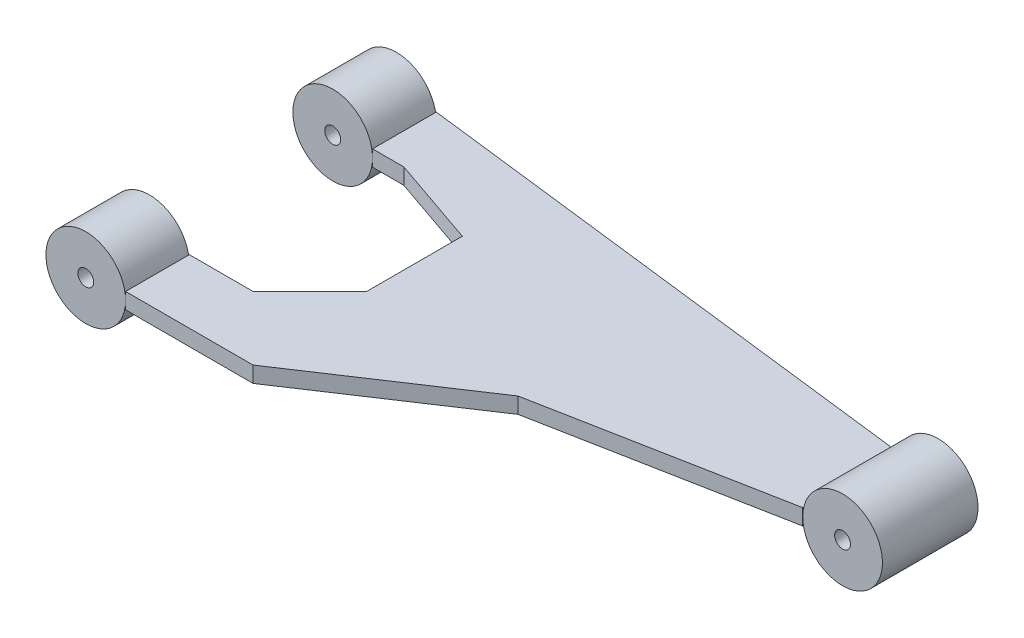
ISO-10303-21;
HEADER;
FILE_DESCRIPTION(('STEP AP214'),'2;1');
FILE_NAME('part.step','',(''),(''),'','','');
FILE_SCHEMA(('AUTOMOTIVE_DESIGN { 1 0 10303 214 1 1 1 1 }'));
ENDSEC;
DATA;
#1=APPLICATION_CONTEXT('core data for automotive mechanical design processes');
#2=APPLICATION_PROTOCOL_DEFINITION('international standard','automotive_design',2000,#1);
#3=PRODUCT_CONTEXT('',#1,'mechanical');
#4=PRODUCT('Part','Part','',(#3));
#5=PRODUCT_RELATED_PRODUCT_CATEGORY('part','',(#4));
#6=PRODUCT_DEFINITION_FORMATION('','',#4);
#7=PRODUCT_DEFINITION_CONTEXT('part definition',#1,'design');
#8=PRODUCT_DEFINITION('design','',#6,#7);
#9=PRODUCT_DEFINITION_SHAPE('','',#8);
#10=(LENGTH_UNIT() NAMED_UNIT(*) SI_UNIT(.MILLI.,.METRE.));
#11=(NAMED_UNIT(*) PLANE_ANGLE_UNIT() SI_UNIT($,.RADIAN.));
#12=(NAMED_UNIT(*) SI_UNIT($,.STERADIAN.) SOLID_ANGLE_UNIT());
#13=UNCERTAINTY_MEASURE_WITH_UNIT(LENGTH_MEASURE(1.E-05),#10,'distance_accuracy_value','');
#14=(GEOMETRIC_REPRESENTATION_CONTEXT(3) GLOBAL_UNCERTAINTY_ASSIGNED_CONTEXT((#13)) GLOBAL_UNIT_ASSIGNED_CONTEXT((#10,
#11,#12)) REPRESENTATION_CONTEXT('',''));
#15=CARTESIAN_POINT('',(0.,0.,0.));
#16=DIRECTION('',(0.,0.,1.));
#17=DIRECTION('',(1.,0.,0.));
#18=AXIS2_PLACEMENT_3D('',#15,#16,#17);
#19=CARTESIAN_POINT('',(0.,0.,123.825));
#20=DIRECTION('',(0.,0.,-1.));
#21=DIRECTION('',(-1.,0.,0.));
#22=AXIS2_PLACEMENT_3D('',#19,#20,#21);
#23=CYLINDRICAL_SURFACE('',#22,3.175);
#24=CARTESIAN_POINT('',(0.,0.,98.425));
#25=DIRECTION('',(0.,0.,1.));
#26=DIRECTION('',(1.,0.,0.));
#27=AXIS2_PLACEMENT_3D('',#24,#25,#26);
#28=CIRCLE('',#27,3.175);
#29=CARTESIAN_POINT('',(3.175,0.,98.425));
#30=VERTEX_POINT('',#29);
#31=EDGE_CURVE('E11',#30,#30,#28,.T.);
#32=ORIENTED_EDGE('',*,*,#31,.F.);
#33=EDGE_LOOP('',(#32));
#34=FACE_BOUND('',#33,.T.);
#35=CARTESIAN_POINT('',(0.,0.,123.825));
#36=DIRECTION('',(0.,0.,1.));
#37=DIRECTION('',(1.,0.,0.));
#38=AXIS2_PLACEMENT_3D('',#35,#36,#37);
#39=CIRCLE('',#38,3.175);
#40=CARTESIAN_POINT('',(3.175,0.,123.825));
#41=VERTEX_POINT('',#40);
#42=EDGE_CURVE('E56',#41,#41,#39,.T.);
#43=ORIENTED_EDGE('',*,*,#42,.T.);
#44=EDGE_LOOP('',(#43));
#45=FACE_BOUND('',#44,.T.);
#46=ADVANCED_FACE('F42',(#34,#45),#23,.F.);
#47=CARTESIAN_POINT('',(0.,0.,123.825));
#48=DIRECTION('',(0.,0.,1.));
#49=DIRECTION('',(1.,0.,0.));
#50=AXIS2_PLACEMENT_3D('',#47,#48,#49);
#51=PLANE('',#50);
#52=CARTESIAN_POINT('',(0.,0.,123.825));
#53=DIRECTION('',(0.,0.,1.));
#54=DIRECTION('',(1.,0.,0.));
#55=AXIS2_PLACEMENT_3D('',#52,#53,#54);
#56=CIRCLE('',#55,15.875);
#57=CARTESIAN_POINT('',(15.875,0.,123.825));
#58=VERTEX_POINT('',#57);
#59=EDGE_CURVE('E53',#58,#58,#56,.T.);
#60=ORIENTED_EDGE('',*,*,#59,.T.);
#61=EDGE_LOOP('',(#60));
#62=FACE_BOUND('',#61,.T.);
#63=ORIENTED_EDGE('',*,*,#42,.F.);
#64=EDGE_LOOP('',(#63));
#65=FACE_BOUND('',#64,.T.);
#66=ADVANCED_FACE('F61',(#62,#65),#51,.T.);
#67=CARTESIAN_POINT('',(0.,0.,123.825));
#68=DIRECTION('',(0.,0.,-1.));
#69=DIRECTION('',(-1.,0.,0.));
#70=AXIS2_PLACEMENT_3D('',#67,#68,#69);
#71=CYLINDRICAL_SURFACE('',#70,15.875);
#72=CARTESIAN_POINT('',(0.,0.,98.425));
#73=DIRECTION('',(0.,0.,1.));
#74=DIRECTION('',(1.,0.,0.));
#75=AXIS2_PLACEMENT_3D('',#72,#73,#74);
#76=CIRCLE('',#75,15.875);
#77=CARTESIAN_POINT('',(15.875,0.,98.425));
#78=VERTEX_POINT('',#77);
#79=EDGE_CURVE('E45',#78,#78,#76,.T.);
#80=ORIENTED_EDGE('',*,*,#79,.T.);
#81=EDGE_LOOP('',(#80));
#82=FACE_BOUND('',#81,.T.);
#83=ORIENTED_EDGE('',*,*,#59,.F.);
#84=EDGE_LOOP('',(#83));
#85=FACE_BOUND('',#84,.T.);
#86=ADVANCED_FACE('F63',(#82,#85),#71,.T.);
#87=CARTESIAN_POINT('',(15.875,-15.875,98.425));
#88=DIRECTION('',(0.,0.,1.));
#89=DIRECTION('',(1.,0.,0.));
#90=AXIS2_PLACEMENT_3D('',#87,#88,#89);
#91=PLANE('',#90);
#92=ORIENTED_EDGE('',*,*,#31,.T.);
#93=EDGE_LOOP('',(#92));
#94=FACE_BOUND('',#93,.T.);
#95=ORIENTED_EDGE('',*,*,#79,.F.);
#96=EDGE_LOOP('',(#95));
#97=FACE_BOUND('',#96,.T.);
#98=ADVANCED_FACE('F70',(#94,#97),#91,.F.);
#99=CLOSED_SHELL('',(#46,#66,#86,#98));
#100=MANIFOLD_SOLID_BREP('B2',#99);
#101=CARTESIAN_POINT('',(15.875,3.175,0.));
#102=DIRECTION('',(1.,0.,0.));
#103=DIRECTION('',(0.,0.,-1.));
#104=AXIS2_PLACEMENT_3D('',#101,#102,#103);
#105=PLANE('',#104);
#106=DIRECTION('',(0.,0.,1.));
#107=VECTOR('',#106,1.);
#108=CARTESIAN_POINT('',(15.875,-3.175,0.));
#109=LINE('',#108,#107);
#110=CARTESIAN_POINT('',(15.875,-3.175,0.));
#111=VERTEX_POINT('',#110);
#112=CARTESIAN_POINT('',(15.875,-3.175,25.4));
#113=VERTEX_POINT('',#112);
#114=EDGE_CURVE('E232',#111,#113,#109,.T.);
#115=ORIENTED_EDGE('',*,*,#114,.T.);
#116=DIRECTION('',(0.,-1.,0.));
#117=VECTOR('',#116,1.);
#118=CARTESIAN_POINT('',(15.875,3.175,25.4));
#119=LINE('',#118,#117);
#120=CARTESIAN_POINT('',(15.875,3.175,25.4));
#121=VERTEX_POINT('',#120);
#122=EDGE_CURVE('E40',#121,#113,#119,.T.);
#123=ORIENTED_EDGE('',*,*,#122,.F.);
#124=DIRECTION('',(0.,0.,1.));
#125=VECTOR('',#124,1.);
#126=CARTESIAN_POINT('',(15.875,3.175,0.));
#127=LINE('',#126,#125);
#128=CARTESIAN_POINT('',(15.875,3.175,0.));
#129=VERTEX_POINT('',#128);
#130=EDGE_CURVE('E254',#129,#121,#127,.T.);
#131=ORIENTED_EDGE('',*,*,#130,.F.);
#132=DIRECTION('',(0.,-1.,0.));
#133=VECTOR('',#132,1.);
#134=CARTESIAN_POINT('',(15.875,3.175,0.));
#135=LINE('',#134,#133);
#136=EDGE_CURVE('E228',#129,#111,#135,.T.);
#137=ORIENTED_EDGE('',*,*,#136,.T.);
#138=EDGE_LOOP('',(#115,#123,#131,#137));
#139=FACE_BOUND('',#138,.T.);
#140=ADVANCED_FACE('F112',(#139),#105,.F.);
#141=CARTESIAN_POINT('',(15.875,3.175,25.4));
#142=DIRECTION('',(0.,0.,-1.));
#143=DIRECTION('',(-1.,0.,0.));
#144=AXIS2_PLACEMENT_3D('',#141,#142,#143);
#145=PLANE('',#144);
#146=DIRECTION('',(1.,0.,0.));
#147=VECTOR('',#146,1.);
#148=CARTESIAN_POINT('',(15.875,-3.175,25.4));
#149=LINE('',#148,#147);
#150=CARTESIAN_POINT('',(28.3551795276803,-3.175,25.4));
#151=VERTEX_POINT('',#150);
#152=EDGE_CURVE('E235',#113,#151,#149,.T.);
#153=ORIENTED_EDGE('',*,*,#152,.T.);
#154=DIRECTION('',(0.,-1.,0.));
#155=VECTOR('',#154,1.);
#156=CARTESIAN_POINT('',(28.3551795276803,3.175,25.4));
#157=LINE('',#156,#155);
#158=CARTESIAN_POINT('',(28.3551795276803,3.175,25.4));
#159=VERTEX_POINT('',#158);
#160=EDGE_CURVE('E120',#159,#151,#157,.T.);
#161=ORIENTED_EDGE('',*,*,#160,.F.);
#162=DIRECTION('',(1.,0.,0.));
#163=VECTOR('',#162,1.);
#164=CARTESIAN_POINT('',(15.875,3.175,25.4));
#165=LINE('',#164,#163);
#166=EDGE_CURVE('E183',#121,#159,#165,.T.);
#167=ORIENTED_EDGE('',*,*,#166,.F.);
#168=ORIENTED_EDGE('',*,*,#122,.T.);
#169=EDGE_LOOP('',(#153,#161,#167,#168));
#170=FACE_BOUND('',#169,.T.);
#171=ADVANCED_FACE('F332',(#170),#145,.F.);
#172=CARTESIAN_POINT('',(28.3551795276803,3.175,25.4));
#173=DIRECTION('',(0.32632204753159,0.,-0.945258653118177));
#174=DIRECTION('',(-0.945258653118178,0.,-0.32632204753159));
#175=AXIS2_PLACEMENT_3D('',#172,#173,#174);
#176=PLANE('',#175);
#177=DIRECTION('',(0.945258653118177,0.,0.32632204753159));
#178=VECTOR('',#177,1.);
#179=CARTESIAN_POINT('',(28.3551795276803,-3.175,25.4));
#180=LINE('',#179,#178);
#181=CARTESIAN_POINT('',(63.9217232281594,-3.175,37.6782767718405));
#182=VERTEX_POINT('',#181);
#183=EDGE_CURVE('E237',#151,#182,#180,.T.);
#184=ORIENTED_EDGE('',*,*,#183,.T.);
#185=DIRECTION('',(0.,-1.,0.));
#186=VECTOR('',#185,1.);
#187=CARTESIAN_POINT('',(63.9217232281594,3.175,37.6782767718405));
#188=LINE('',#187,#186);
#189=CARTESIAN_POINT('',(63.9217232281594,3.175,37.6782767718405));
#190=VERTEX_POINT('',#189);
#191=EDGE_CURVE('E273',#190,#182,#188,.T.);
#192=ORIENTED_EDGE('',*,*,#191,.F.);
#193=DIRECTION('',(0.945258653118177,0.,0.32632204753159));
#194=VECTOR('',#193,1.);
#195=CARTESIAN_POINT('',(28.3551795276803,3.175,25.4));
#196=LINE('',#195,#194);
#197=EDGE_CURVE('E281',#159,#190,#196,.T.);
#198=ORIENTED_EDGE('',*,*,#197,.F.);
#199=ORIENTED_EDGE('',*,*,#160,.T.);
#200=EDGE_LOOP('',(#184,#192,#198,#199));
#201=FACE_BOUND('',#200,.T.);
#202=ADVANCED_FACE('F279',(#201),#176,.F.);
#203=CARTESIAN_POINT('',(63.9217232281594,3.175,37.6782767718405));
#204=DIRECTION('',(1.,0.,0.));
#205=DIRECTION('',(0.,0.,-1.));
#206=AXIS2_PLACEMENT_3D('',#203,#204,#205);
#207=PLANE('',#206);
#208=DIRECTION('',(0.,0.,1.));
#209=VECTOR('',#208,1.);
#210=CARTESIAN_POINT('',(63.9217232281594,-3.175,37.6782767718405));
#211=LINE('',#210,#209);
#212=CARTESIAN_POINT('',(63.9217232281594,-3.175,75.7782767718405));
#213=VERTEX_POINT('',#212);
#214=EDGE_CURVE('E239',#182,#213,#211,.T.);
#215=ORIENTED_EDGE('',*,*,#214,.T.);
#216=DIRECTION('',(0.,-1.,0.));
#217=VECTOR('',#216,1.);
#218=CARTESIAN_POINT('',(63.9217232281594,3.175,75.7782767718405));
#219=LINE('',#218,#217);
#220=CARTESIAN_POINT('',(63.9217232281594,3.175,75.7782767718405));
#221=VERTEX_POINT('',#220);
#222=EDGE_CURVE('E270',#221,#213,#219,.T.);
#223=ORIENTED_EDGE('',*,*,#222,.F.);
#224=DIRECTION('',(0.,0.,1.));
#225=VECTOR('',#224,1.);
#226=CARTESIAN_POINT('',(63.9217232281594,3.175,37.6782767718405));
#227=LINE('',#226,#225);
#228=EDGE_CURVE('E299',#190,#221,#227,.T.);
#229=ORIENTED_EDGE('',*,*,#228,.F.);
#230=ORIENTED_EDGE('',*,*,#191,.T.);
#231=EDGE_LOOP('',(#215,#223,#229,#230));
#232=FACE_BOUND('',#231,.T.);
#233=ADVANCED_FACE('F290',(#232),#207,.F.);
#234=CARTESIAN_POINT('',(63.9217232281594,3.175,75.7782767718405));
#235=DIRECTION('',(0.707106781186549,0.,0.707106781186546));
#236=DIRECTION('',(0.707106781186546,0.,-0.707106781186549));
#237=AXIS2_PLACEMENT_3D('',#234,#235,#236);
#238=PLANE('',#237);
#239=DIRECTION('',(-0.707106781186546,0.,0.707106781186549));
#240=VECTOR('',#239,1.);
#241=CARTESIAN_POINT('',(63.9217232281594,-3.175,75.7782767718405));
#242=LINE('',#241,#240);
#243=CARTESIAN_POINT('',(41.275,-3.175,98.425));
#244=VERTEX_POINT('',#243);
#245=EDGE_CURVE('E241',#213,#244,#242,.T.);
#246=ORIENTED_EDGE('',*,*,#245,.T.);
#247=DIRECTION('',(0.,-1.,0.));
#248=VECTOR('',#247,1.);
#249=CARTESIAN_POINT('',(41.275,3.175,98.425));
#250=LINE('',#249,#248);
#251=CARTESIAN_POINT('',(41.275,3.175,98.425));
#252=VERTEX_POINT('',#251);
#253=EDGE_CURVE('E267',#252,#244,#250,.T.);
#254=ORIENTED_EDGE('',*,*,#253,.F.);
#255=DIRECTION('',(-0.707106781186546,0.,0.707106781186549));
#256=VECTOR('',#255,1.);
#257=CARTESIAN_POINT('',(63.9217232281594,3.175,75.7782767718405));
#258=LINE('',#257,#256);
#259=EDGE_CURVE('E296',#221,#252,#258,.T.);
#260=ORIENTED_EDGE('',*,*,#259,.F.);
#261=ORIENTED_EDGE('',*,*,#222,.T.);
#262=EDGE_LOOP('',(#246,#254,#260,#261));
#263=FACE_BOUND('',#262,.T.);
#264=ADVANCED_FACE('F294',(#263),#238,.F.);
#265=CARTESIAN_POINT('',(41.275,3.175,98.425));
#266=DIRECTION('',(0.,0.,1.));
#267=DIRECTION('',(1.,0.,0.));
#268=AXIS2_PLACEMENT_3D('',#265,#266,#267);
#269=PLANE('',#268);
#270=DIRECTION('',(-1.,0.,0.));
#271=VECTOR('',#270,1.);
#272=CARTESIAN_POINT('',(41.275,-3.175,98.425));
#273=LINE('',#272,#271);
#274=CARTESIAN_POINT('',(15.875,-3.175,98.425));
#275=VERTEX_POINT('',#274);
#276=EDGE_CURVE('E243',#244,#275,#273,.T.);
#277=ORIENTED_EDGE('',*,*,#276,.T.);
#278=DIRECTION('',(0.,-1.,0.));
#279=VECTOR('',#278,1.);
#280=CARTESIAN_POINT('',(15.875,3.175,98.425));
#281=LINE('',#280,#279);
#282=CARTESIAN_POINT('',(15.875,3.175,98.425));
#283=VERTEX_POINT('',#282);
#284=EDGE_CURVE('E264',#283,#275,#281,.T.);
#285=ORIENTED_EDGE('',*,*,#284,.F.);
#286=DIRECTION('',(-1.,0.,0.));
#287=VECTOR('',#286,1.);
#288=CARTESIAN_POINT('',(41.275,3.175,98.425));
#289=LINE('',#288,#287);
#290=EDGE_CURVE('E298',#252,#283,#289,.T.);
#291=ORIENTED_EDGE('',*,*,#290,.F.);
#292=ORIENTED_EDGE('',*,*,#253,.T.);
#293=EDGE_LOOP('',(#277,#285,#291,#292));
#294=FACE_BOUND('',#293,.T.);
#295=ADVANCED_FACE('F345',(#294),#269,.F.);
#296=CARTESIAN_POINT('',(15.875,3.175,98.425));
#297=DIRECTION('',(1.,0.,0.));
#298=DIRECTION('',(0.,0.,-1.));
#299=AXIS2_PLACEMENT_3D('',#296,#297,#298);
#300=PLANE('',#299);
#301=DIRECTION('',(0.,0.,1.));
#302=VECTOR('',#301,1.);
#303=CARTESIAN_POINT('',(15.875,-3.175,98.425));
#304=LINE('',#303,#302);
#305=CARTESIAN_POINT('',(15.875,-3.175,123.825));
#306=VERTEX_POINT('',#305);
#307=EDGE_CURVE('E245',#275,#306,#304,.T.);
#308=ORIENTED_EDGE('',*,*,#307,.T.);
#309=DIRECTION('',(0.,-1.,0.));
#310=VECTOR('',#309,1.);
#311=CARTESIAN_POINT('',(15.875,3.175,123.825));
#312=LINE('',#311,#310);
#313=CARTESIAN_POINT('',(15.875,3.175,123.825));
#314=VERTEX_POINT('',#313);
#315=EDGE_CURVE('E261',#314,#306,#312,.T.);
#316=ORIENTED_EDGE('',*,*,#315,.F.);
#317=DIRECTION('',(0.,0.,1.));
#318=VECTOR('',#317,1.);
#319=CARTESIAN_POINT('',(15.875,3.175,98.425));
#320=LINE('',#319,#318);
#321=EDGE_CURVE('E301',#283,#314,#320,.T.);
#322=ORIENTED_EDGE('',*,*,#321,.F.);
#323=ORIENTED_EDGE('',*,*,#284,.T.);
#324=EDGE_LOOP('',(#308,#316,#322,#323));
#325=FACE_BOUND('',#324,.T.);
#326=ADVANCED_FACE('F348',(#325),#300,.F.);
#327=CARTESIAN_POINT('',(15.875,3.175,123.825));
#328=DIRECTION('',(0.,0.,-1.));
#329=DIRECTION('',(-1.,0.,0.));
#330=AXIS2_PLACEMENT_3D('',#327,#328,#329);
#331=PLANE('',#330);
#332=DIRECTION('',(1.,0.,0.));
#333=VECTOR('',#332,1.);
#334=CARTESIAN_POINT('',(15.875,-3.175,123.825));
#335=LINE('',#334,#333);
#336=CARTESIAN_POINT('',(66.675,-3.175,123.825));
#337=VERTEX_POINT('',#336);
#338=EDGE_CURVE('E247',#306,#337,#335,.T.);
#339=ORIENTED_EDGE('',*,*,#338,.T.);
#340=DIRECTION('',(0.,-1.,0.));
#341=VECTOR('',#340,1.);
#342=CARTESIAN_POINT('',(66.675,3.175,123.825));
#343=LINE('',#342,#341);
#344=CARTESIAN_POINT('',(66.675,3.175,123.825));
#345=VERTEX_POINT('',#344);
#346=EDGE_CURVE('E258',#345,#337,#343,.T.);
#347=ORIENTED_EDGE('',*,*,#346,.F.);
#348=DIRECTION('',(1.,0.,0.));
#349=VECTOR('',#348,1.);
#350=CARTESIAN_POINT('',(15.875,3.175,123.825));
#351=LINE('',#350,#349);
#352=EDGE_CURVE('E307',#314,#345,#351,.T.);
#353=ORIENTED_EDGE('',*,*,#352,.F.);
#354=ORIENTED_EDGE('',*,*,#315,.T.);
#355=EDGE_LOOP('',(#339,#347,#353,#354));
#356=FACE_BOUND('',#355,.T.);
#357=ADVANCED_FACE('F313',(#356),#331,.F.);
#358=CARTESIAN_POINT('',(66.675,3.175,123.825));
#359=DIRECTION('',(-0.552770798392567,0.,-0.833333333333333));
#360=DIRECTION('',(-0.833333333333333,0.,0.552770798392567));
#361=AXIS2_PLACEMENT_3D('',#358,#359,#360);
#362=PLANE('',#361);
#363=DIRECTION('',(0.833333333333333,0.,-0.552770798392567));
#364=VECTOR('',#363,1.);
#365=CARTESIAN_POINT('',(66.675,-3.175,123.825));
#366=LINE('',#365,#364);
#367=CARTESIAN_POINT('',(130.175,-3.175,81.7038651624864));
#368=VERTEX_POINT('',#367);
#369=EDGE_CURVE('E249',#337,#368,#366,.T.);
#370=ORIENTED_EDGE('',*,*,#369,.T.);
#371=DIRECTION('',(0.,-1.,0.));
#372=VECTOR('',#371,1.);
#373=CARTESIAN_POINT('',(130.175,3.175,81.7038651624864));
#374=LINE('',#373,#372);
#375=CARTESIAN_POINT('',(130.175,3.175,81.7038651624864));
#376=VERTEX_POINT('',#375);
#377=EDGE_CURVE('E223',#376,#368,#374,.T.);
#378=ORIENTED_EDGE('',*,*,#377,.F.);
#379=DIRECTION('',(0.833333333333333,0.,-0.552770798392567));
#380=VECTOR('',#379,1.);
#381=CARTESIAN_POINT('',(66.675,3.175,123.825));
#382=LINE('',#381,#380);
#383=EDGE_CURVE('E214',#345,#376,#382,.T.);
#384=ORIENTED_EDGE('',*,*,#383,.F.);
#385=ORIENTED_EDGE('',*,*,#346,.T.);
#386=EDGE_LOOP('',(#370,#378,#384,#385));
#387=FACE_BOUND('',#386,.T.);
#388=ADVANCED_FACE('F317',(#387),#362,.F.);
#389=CARTESIAN_POINT('',(130.175,3.175,81.7038651624864));
#390=DIRECTION('',(-0.187719163889927,0.,-0.982222742308722));
#391=DIRECTION('',(-0.982222742308722,0.,0.187719163889927));
#392=AXIS2_PLACEMENT_3D('',#389,#390,#391);
#393=PLANE('',#392);
#394=DIRECTION('',(0.982222742308722,0.,-0.187719163889927));
#395=VECTOR('',#394,1.);
#396=CARTESIAN_POINT('',(130.175,-3.175,81.7038651624864));
#397=LINE('',#396,#395);
#398=CARTESIAN_POINT('',(225.425,-3.175,63.5));
#399=VERTEX_POINT('',#398);
#400=EDGE_CURVE('E222',#368,#399,#397,.T.);
#401=ORIENTED_EDGE('',*,*,#400,.T.);
#402=DIRECTION('',(0.,-1.,0.));
#403=VECTOR('',#402,1.);
#404=CARTESIAN_POINT('',(225.425,3.175,63.5));
#405=LINE('',#404,#403);
#406=CARTESIAN_POINT('',(225.425,3.175,63.5));
#407=VERTEX_POINT('',#406);
#408=EDGE_CURVE('E219',#407,#399,#405,.T.);
#409=ORIENTED_EDGE('',*,*,#408,.F.);
#410=DIRECTION('',(0.982222742308722,0.,-0.187719163889927));
#411=VECTOR('',#410,1.);
#412=CARTESIAN_POINT('',(130.175,3.175,81.7038651624864));
#413=LINE('',#412,#411);
#414=EDGE_CURVE('E208',#376,#407,#413,.T.);
#415=ORIENTED_EDGE('',*,*,#414,.F.);
#416=ORIENTED_EDGE('',*,*,#377,.T.);
#417=EDGE_LOOP('',(#401,#409,#415,#416));
#418=FACE_BOUND('',#417,.T.);
#419=ADVANCED_FACE('F220',(#418),#393,.F.);
#420=CARTESIAN_POINT('',(225.425,3.175,25.4));
#421=DIRECTION('',(-1.,0.,0.));
#422=DIRECTION('',(0.,0.,1.));
#423=AXIS2_PLACEMENT_3D('',#420,#421,#422);
#424=PLANE('',#423);
#425=DIRECTION('',(0.,0.,-1.));
#426=VECTOR('',#425,1.);
#427=CARTESIAN_POINT('',(225.425,-3.175,25.4));
#428=LINE('',#427,#426);
#429=CARTESIAN_POINT('',(225.425,-3.175,25.4));
#430=VERTEX_POINT('',#429);
#431=EDGE_CURVE('E169',#399,#430,#428,.T.);
#432=ORIENTED_EDGE('',*,*,#431,.T.);
#433=DIRECTION('',(0.,-1.,0.));
#434=VECTOR('',#433,1.);
#435=CARTESIAN_POINT('',(225.425,3.175,25.4));
#436=LINE('',#435,#434);
#437=CARTESIAN_POINT('',(225.425,3.175,25.4));
#438=VERTEX_POINT('',#437);
#439=EDGE_CURVE('E224',#438,#430,#436,.T.);
#440=ORIENTED_EDGE('',*,*,#439,.F.);
#441=DIRECTION('',(0.,0.,-1.));
#442=VECTOR('',#441,1.);
#443=CARTESIAN_POINT('',(225.425,3.175,25.4));
#444=LINE('',#443,#442);
#445=EDGE_CURVE('E212',#407,#438,#444,.T.);
#446=ORIENTED_EDGE('',*,*,#445,.F.);
#447=ORIENTED_EDGE('',*,*,#408,.T.);
#448=EDGE_LOOP('',(#432,#440,#446,#447));
#449=FACE_BOUND('',#448,.T.);
#450=ADVANCED_FACE('F226',(#449),#424,.F.);
#451=CARTESIAN_POINT('',(15.875,3.175,0.));
#452=DIRECTION('',(-0.120331367519237,0.,0.992733782033708));
#453=DIRECTION('',(0.992733782033708,0.,0.120331367519237));
#454=AXIS2_PLACEMENT_3D('',#451,#452,#453);
#455=PLANE('',#454);
#456=DIRECTION('',(-0.992733782033708,0.,-0.120331367519237));
#457=VECTOR('',#456,1.);
#458=CARTESIAN_POINT('',(15.875,-3.175,0.));
#459=LINE('',#458,#457);
#460=EDGE_CURVE('E175',#430,#111,#459,.T.);
#461=ORIENTED_EDGE('',*,*,#460,.T.);
#462=ORIENTED_EDGE('',*,*,#136,.F.);
#463=DIRECTION('',(-0.992733782033708,0.,-0.120331367519237));
#464=VECTOR('',#463,1.);
#465=CARTESIAN_POINT('',(15.875,3.175,0.));
#466=LINE('',#465,#464);
#467=EDGE_CURVE('E128',#438,#129,#466,.T.);
#468=ORIENTED_EDGE('',*,*,#467,.F.);
#469=ORIENTED_EDGE('',*,*,#439,.T.);
#470=EDGE_LOOP('',(#461,#462,#468,#469));
#471=FACE_BOUND('',#470,.T.);
#472=ADVANCED_FACE('F321',(#471),#455,.F.);
#473=CARTESIAN_POINT('',(0.,3.175,0.));
#474=DIRECTION('',(0.,1.,0.));
#475=DIRECTION('',(0.,0.,1.));
#476=AXIS2_PLACEMENT_3D('',#473,#474,#475);
#477=PLANE('',#476);
#478=ORIENTED_EDGE('',*,*,#130,.T.);
#479=ORIENTED_EDGE('',*,*,#166,.T.);
#480=ORIENTED_EDGE('',*,*,#197,.T.);
#481=ORIENTED_EDGE('',*,*,#228,.T.);
#482=ORIENTED_EDGE('',*,*,#259,.T.);
#483=ORIENTED_EDGE('',*,*,#290,.T.);
#484=ORIENTED_EDGE('',*,*,#321,.T.);
#485=ORIENTED_EDGE('',*,*,#352,.T.);
#486=ORIENTED_EDGE('',*,*,#383,.T.);
#487=ORIENTED_EDGE('',*,*,#414,.T.);
#488=ORIENTED_EDGE('',*,*,#445,.T.);
#489=ORIENTED_EDGE('',*,*,#467,.T.);
#490=EDGE_LOOP('',(#478,#479,#480,#481,#482,#483,#484,#485,#486,#487,#488,#489));
#491=FACE_BOUND('',#490,.T.);
#492=ADVANCED_FACE('F210',(#491),#477,.T.);
#493=CARTESIAN_POINT('',(0.,-3.175,0.));
#494=DIRECTION('',(0.,1.,0.));
#495=DIRECTION('',(0.,0.,1.));
#496=AXIS2_PLACEMENT_3D('',#493,#494,#495);
#497=PLANE('',#496);
#498=ORIENTED_EDGE('',*,*,#114,.F.);
#499=ORIENTED_EDGE('',*,*,#460,.F.);
#500=ORIENTED_EDGE('',*,*,#431,.F.);
#501=ORIENTED_EDGE('',*,*,#400,.F.);
#502=ORIENTED_EDGE('',*,*,#369,.F.);
#503=ORIENTED_EDGE('',*,*,#338,.F.);
#504=ORIENTED_EDGE('',*,*,#307,.F.);
#505=ORIENTED_EDGE('',*,*,#276,.F.);
#506=ORIENTED_EDGE('',*,*,#245,.F.);
#507=ORIENTED_EDGE('',*,*,#214,.F.);
#508=ORIENTED_EDGE('',*,*,#183,.F.);
#509=ORIENTED_EDGE('',*,*,#152,.F.);
#510=EDGE_LOOP('',(#498,#499,#500,#501,#502,#503,#504,#505,#506,#507,#508,#509));
#511=FACE_BOUND('',#510,.T.);
#512=ADVANCED_FACE('F285',(#511),#497,.F.);
#513=CLOSED_SHELL('',(#140,#171,#202,#233,#264,#295,#326,#357,#388,#419,#450,#472,#492,#512));
#514=MANIFOLD_SOLID_BREP('B6',#513);
#515=CARTESIAN_POINT('',(241.3,0.,123.825));
#516=DIRECTION('',(0.,0.,-1.));
#517=DIRECTION('',(-1.,0.,0.));
#518=AXIS2_PLACEMENT_3D('',#515,#516,#517);
#519=CYLINDRICAL_SURFACE('',#518,3.175);
#520=CARTESIAN_POINT('',(241.3,0.,25.4));
#521=DIRECTION('',(0.,0.,1.));
#522=DIRECTION('',(1.,0.,0.));
#523=AXIS2_PLACEMENT_3D('',#520,#521,#522);
#524=CIRCLE('',#523,3.175);
#525=CARTESIAN_POINT('',(244.475,0.,25.4));
#526=VERTEX_POINT('',#525);
#527=EDGE_CURVE('E455',#526,#526,#524,.T.);
#528=ORIENTED_EDGE('',*,*,#527,.F.);
#529=EDGE_LOOP('',(#528));
#530=FACE_BOUND('',#529,.T.);
#531=CARTESIAN_POINT('',(241.3,0.,63.5));
#532=DIRECTION('',(0.,0.,-1.));
#533=DIRECTION('',(-1.,0.,0.));
#534=AXIS2_PLACEMENT_3D('',#531,#532,#533);
#535=CIRCLE('',#534,3.175);
#536=CARTESIAN_POINT('',(238.125,0.,63.5));
#537=VERTEX_POINT('',#536);
#538=EDGE_CURVE('E465',#537,#537,#535,.T.);
#539=ORIENTED_EDGE('',*,*,#538,.F.);
#540=EDGE_LOOP('',(#539));
#541=FACE_BOUND('',#540,.T.);
#542=ADVANCED_FACE('F451',(#530,#541),#519,.F.);
#543=CARTESIAN_POINT('',(225.425,-15.875,63.5));
#544=DIRECTION('',(0.,0.,-1.));
#545=DIRECTION('',(-1.,0.,0.));
#546=AXIS2_PLACEMENT_3D('',#543,#544,#545);
#547=PLANE('',#546);
#548=ORIENTED_EDGE('',*,*,#538,.T.);
#549=EDGE_LOOP('',(#548));
#550=FACE_BOUND('',#549,.T.);
#551=CARTESIAN_POINT('',(241.3,0.,63.5));
#552=DIRECTION('',(0.,0.,-1.));
#553=DIRECTION('',(-1.,0.,0.));
#554=AXIS2_PLACEMENT_3D('',#551,#552,#553);
#555=CIRCLE('',#554,15.875);
#556=CARTESIAN_POINT('',(225.425,0.,63.5));
#557=VERTEX_POINT('',#556);
#558=EDGE_CURVE('E463',#557,#557,#555,.T.);
#559=ORIENTED_EDGE('',*,*,#558,.F.);
#560=EDGE_LOOP('',(#559));
#561=FACE_BOUND('',#560,.T.);
#562=ADVANCED_FACE('F473',(#550,#561),#547,.F.);
#563=CARTESIAN_POINT('',(225.425,-15.875,25.4));
#564=DIRECTION('',(0.,0.,1.));
#565=DIRECTION('',(1.,0.,0.));
#566=AXIS2_PLACEMENT_3D('',#563,#564,#565);
#567=PLANE('',#566);
#568=ORIENTED_EDGE('',*,*,#527,.T.);
#569=EDGE_LOOP('',(#568));
#570=FACE_BOUND('',#569,.T.);
#571=CARTESIAN_POINT('',(241.3,0.,25.4));
#572=DIRECTION('',(0.,0.,1.));
#573=DIRECTION('',(1.,0.,0.));
#574=AXIS2_PLACEMENT_3D('',#571,#572,#573);
#575=CIRCLE('',#574,15.875);
#576=CARTESIAN_POINT('',(257.175,0.,25.4));
#577=VERTEX_POINT('',#576);
#578=EDGE_CURVE('E111',#577,#577,#575,.T.);
#579=ORIENTED_EDGE('',*,*,#578,.F.);
#580=EDGE_LOOP('',(#579));
#581=FACE_BOUND('',#580,.T.);
#582=ADVANCED_FACE('F475',(#570,#581),#567,.F.);
#583=CARTESIAN_POINT('',(241.3,0.,123.825));
#584=DIRECTION('',(0.,0.,-1.));
#585=DIRECTION('',(-1.,0.,0.));
#586=AXIS2_PLACEMENT_3D('',#583,#584,#585);
#587=CYLINDRICAL_SURFACE('',#586,15.875);
#588=ORIENTED_EDGE('',*,*,#578,.T.);
#589=EDGE_LOOP('',(#588));
#590=FACE_BOUND('',#589,.T.);
#591=ORIENTED_EDGE('',*,*,#558,.T.);
#592=EDGE_LOOP('',(#591));
#593=FACE_BOUND('',#592,.T.);
#594=ADVANCED_FACE('F453',(#590,#593),#587,.T.);
#595=CLOSED_SHELL('',(#542,#562,#582,#594));
#596=MANIFOLD_SOLID_BREP('B34',#595);
#597=CARTESIAN_POINT('',(0.,0.,123.825));
#598=DIRECTION('',(0.,0.,-1.));
#599=DIRECTION('',(-1.,0.,0.));
#600=AXIS2_PLACEMENT_3D('',#597,#598,#599);
#601=CYLINDRICAL_SURFACE('',#600,15.875);
#602=CARTESIAN_POINT('',(0.,0.,0.));
#603=DIRECTION('',(0.,0.,1.));
#604=DIRECTION('',(1.,0.,0.));
#605=AXIS2_PLACEMENT_3D('',#602,#603,#604);
#606=CIRCLE('',#605,15.875);
#607=CARTESIAN_POINT('',(15.875,0.,0.));
#608=VERTEX_POINT('',#607);
#609=EDGE_CURVE('E450',#608,#608,#606,.T.);
#610=ORIENTED_EDGE('',*,*,#609,.T.);
#611=EDGE_LOOP('',(#610));
#612=FACE_BOUND('',#611,.T.);
#613=CARTESIAN_POINT('',(0.,0.,25.4));
#614=DIRECTION('',(0.,0.,-1.));
#615=DIRECTION('',(-1.,0.,0.));
#616=AXIS2_PLACEMENT_3D('',#613,#614,#615);
#617=CIRCLE('',#616,15.875);
#618=CARTESIAN_POINT('',(-15.875,0.,25.4));
#619=VERTEX_POINT('',#618);
#620=EDGE_CURVE('E524',#619,#619,#617,.T.);
#621=ORIENTED_EDGE('',*,*,#620,.T.);
#622=EDGE_LOOP('',(#621));
#623=FACE_BOUND('',#622,.T.);
#624=ADVANCED_FACE('F513',(#612,#623),#601,.T.);
#625=CARTESIAN_POINT('',(0.,0.,0.));
#626=DIRECTION('',(0.,0.,1.));
#627=DIRECTION('',(1.,0.,0.));
#628=AXIS2_PLACEMENT_3D('',#625,#626,#627);
#629=PLANE('',#628);
#630=ORIENTED_EDGE('',*,*,#609,.F.);
#631=EDGE_LOOP('',(#630));
#632=FACE_BOUND('',#631,.T.);
#633=CARTESIAN_POINT('',(0.,0.,0.));
#634=DIRECTION('',(0.,0.,1.));
#635=DIRECTION('',(1.,0.,0.));
#636=AXIS2_PLACEMENT_3D('',#633,#634,#635);
#637=CIRCLE('',#636,3.175);
#638=CARTESIAN_POINT('',(3.175,0.,0.));
#639=VERTEX_POINT('',#638);
#640=EDGE_CURVE('E520',#639,#639,#637,.T.);
#641=ORIENTED_EDGE('',*,*,#640,.T.);
#642=EDGE_LOOP('',(#641));
#643=FACE_BOUND('',#642,.T.);
#644=ADVANCED_FACE('F539',(#632,#643),#629,.F.);
#645=CARTESIAN_POINT('',(0.,0.,123.825));
#646=DIRECTION('',(0.,0.,-1.));
#647=DIRECTION('',(-1.,0.,0.));
#648=AXIS2_PLACEMENT_3D('',#645,#646,#647);
#649=CYLINDRICAL_SURFACE('',#648,3.175);
#650=CARTESIAN_POINT('',(0.,0.,25.4));
#651=DIRECTION('',(0.,0.,-1.));
#652=DIRECTION('',(-1.,0.,0.));
#653=AXIS2_PLACEMENT_3D('',#650,#651,#652);
#654=CIRCLE('',#653,3.175);
#655=CARTESIAN_POINT('',(-3.175,0.,25.4));
#656=VERTEX_POINT('',#655);
#657=EDGE_CURVE('E516',#656,#656,#654,.T.);
#658=ORIENTED_EDGE('',*,*,#657,.F.);
#659=EDGE_LOOP('',(#658));
#660=FACE_BOUND('',#659,.T.);
#661=ORIENTED_EDGE('',*,*,#640,.F.);
#662=EDGE_LOOP('',(#661));
#663=FACE_BOUND('',#662,.T.);
#664=ADVANCED_FACE('F536',(#660,#663),#649,.F.);
#665=CARTESIAN_POINT('',(15.875,-15.875,25.4));
#666=DIRECTION('',(0.,0.,-1.));
#667=DIRECTION('',(-1.,0.,0.));
#668=AXIS2_PLACEMENT_3D('',#665,#666,#667);
#669=PLANE('',#668);
#670=ORIENTED_EDGE('',*,*,#657,.T.);
#671=EDGE_LOOP('',(#670));
#672=FACE_BOUND('',#671,.T.);
#673=ORIENTED_EDGE('',*,*,#620,.F.);
#674=EDGE_LOOP('',(#673));
#675=FACE_BOUND('',#674,.T.);
#676=ADVANCED_FACE('F533',(#672,#675),#669,.F.);
#677=CLOSED_SHELL('',(#624,#644,#664,#676));
#678=MANIFOLD_SOLID_BREP('B106',#677);
#679=ADVANCED_BREP_SHAPE_REPRESENTATION('',(#18,#100,#514,#596,#678),#14);
#680=SHAPE_DEFINITION_REPRESENTATION(#9,#679);
ENDSEC;
END-ISO-10303-21;
